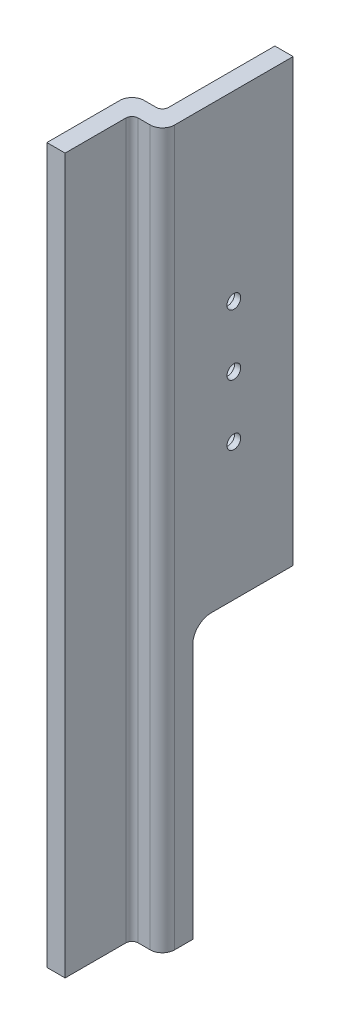
ISO-10303-21;
HEADER;
FILE_DESCRIPTION(('STEP AP214'),'2;1');
FILE_NAME('part.step','',(''),(''),'','','');
FILE_SCHEMA(('AUTOMOTIVE_DESIGN { 1 0 10303 214 1 1 1 1 }'));
ENDSEC;
DATA;
#1=APPLICATION_CONTEXT('core data for automotive mechanical design processes');
#2=APPLICATION_PROTOCOL_DEFINITION('international standard','automotive_design',2000,#1);
#3=PRODUCT_CONTEXT('',#1,'mechanical');
#4=PRODUCT('Part','Part','',(#3));
#5=PRODUCT_RELATED_PRODUCT_CATEGORY('part','',(#4));
#6=PRODUCT_DEFINITION_FORMATION('','',#4);
#7=PRODUCT_DEFINITION_CONTEXT('part definition',#1,'design');
#8=PRODUCT_DEFINITION('design','',#6,#7);
#9=PRODUCT_DEFINITION_SHAPE('','',#8);
#10=(LENGTH_UNIT() NAMED_UNIT(*) SI_UNIT(.MILLI.,.METRE.));
#11=(NAMED_UNIT(*) PLANE_ANGLE_UNIT() SI_UNIT($,.RADIAN.));
#12=(NAMED_UNIT(*) SI_UNIT($,.STERADIAN.) SOLID_ANGLE_UNIT());
#13=UNCERTAINTY_MEASURE_WITH_UNIT(LENGTH_MEASURE(1.E-05),#10,'distance_accuracy_value','');
#14=(GEOMETRIC_REPRESENTATION_CONTEXT(3) GLOBAL_UNCERTAINTY_ASSIGNED_CONTEXT((#13)) GLOBAL_UNIT_ASSIGNED_CONTEXT((#10,
#11,#12)) REPRESENTATION_CONTEXT('',''));
#15=CARTESIAN_POINT('',(0.,0.,0.));
#16=DIRECTION('',(0.,0.,1.));
#17=DIRECTION('',(1.,0.,0.));
#18=AXIS2_PLACEMENT_3D('',#15,#16,#17);
#19=CARTESIAN_POINT('',(0.,235.,-37.));
#20=DIRECTION('',(1.,0.,0.));
#21=DIRECTION('',(0.,0.,-1.));
#22=AXIS2_PLACEMENT_3D('',#19,#20,#21);
#23=PLANE('',#22);
#24=CARTESIAN_POINT('',(0.,175.,-17.5));
#25=DIRECTION('',(-1.,0.,0.));
#26=DIRECTION('',(0.,0.,1.));
#27=AXIS2_PLACEMENT_3D('',#24,#25,#26);
#28=CIRCLE('',#27,4.);
#29=CARTESIAN_POINT('',(0.,175.,-13.5));
#30=VERTEX_POINT('',#29);
#31=EDGE_CURVE('E317',#30,#30,#28,.T.);
#32=ORIENTED_EDGE('',*,*,#31,.F.);
#33=EDGE_LOOP('',(#32));
#34=FACE_BOUND('',#33,.T.);
#35=CARTESIAN_POINT('',(0.,135.,-17.5));
#36=DIRECTION('',(-1.,0.,0.));
#37=DIRECTION('',(0.,0.,1.));
#38=AXIS2_PLACEMENT_3D('',#35,#36,#37);
#39=CIRCLE('',#38,4.);
#40=CARTESIAN_POINT('',(0.,135.,-13.5));
#41=VERTEX_POINT('',#40);
#42=EDGE_CURVE('E293',#41,#41,#39,.T.);
#43=ORIENTED_EDGE('',*,*,#42,.F.);
#44=EDGE_LOOP('',(#43));
#45=FACE_BOUND('',#44,.T.);
#46=DIRECTION('',(0.,0.,1.));
#47=VECTOR('',#46,1.);
#48=CARTESIAN_POINT('',(0.,0.,-37.));
#49=LINE('',#48,#47);
#50=CARTESIAN_POINT('',(0.,0.,-4.));
#51=VERTEX_POINT('',#50);
#52=CARTESIAN_POINT('',(0.,0.,-2.));
#53=VERTEX_POINT('',#52);
#54=EDGE_CURVE('E240',#51,#53,#49,.T.);
#55=ORIENTED_EDGE('',*,*,#54,.T.);
#56=DIRECTION('',(0.,-1.,0.));
#57=VECTOR('',#56,1.);
#58=CARTESIAN_POINT('',(0.,235.,-2.));
#59=LINE('',#58,#57);
#60=CARTESIAN_POINT('',(0.,235.,-2.));
#61=VERTEX_POINT('',#60);
#62=EDGE_CURVE('E185',#53,#61,#59,.F.);
#63=ORIENTED_EDGE('',*,*,#62,.T.);
#64=DIRECTION('',(0.,0.,1.));
#65=VECTOR('',#64,1.);
#66=CARTESIAN_POINT('',(0.,235.,-37.));
#67=LINE('',#66,#65);
#68=CARTESIAN_POINT('',(0.,235.,-37.));
#69=VERTEX_POINT('',#68);
#70=EDGE_CURVE('E242',#69,#61,#67,.T.);
#71=ORIENTED_EDGE('',*,*,#70,.F.);
#72=DIRECTION('',(0.,-1.,0.));
#73=VECTOR('',#72,1.);
#74=CARTESIAN_POINT('',(0.,235.,-37.));
#75=LINE('',#74,#73);
#76=CARTESIAN_POINT('',(0.,90.,-37.));
#77=VERTEX_POINT('',#76);
#78=EDGE_CURVE('E248',#69,#77,#75,.T.);
#79=ORIENTED_EDGE('',*,*,#78,.T.);
#80=DIRECTION('',(0.,0.,1.));
#81=VECTOR('',#80,1.);
#82=CARTESIAN_POINT('',(0.,90.,-37.));
#83=LINE('',#82,#81);
#84=CARTESIAN_POINT('',(0.,90.,-10.));
#85=VERTEX_POINT('',#84);
#86=EDGE_CURVE('E169',#77,#85,#83,.T.);
#87=ORIENTED_EDGE('',*,*,#86,.T.);
#88=CARTESIAN_POINT('',(0.,84.,-10.));
#89=DIRECTION('',(1.,0.,0.));
#90=DIRECTION('',(0.,0.,-1.));
#91=AXIS2_PLACEMENT_3D('',#88,#89,#90);
#92=CIRCLE('',#91,6.);
#93=CARTESIAN_POINT('',(0.,84.,-4.));
#94=VERTEX_POINT('',#93);
#95=EDGE_CURVE('E11',#85,#94,#92,.T.);
#96=ORIENTED_EDGE('',*,*,#95,.T.);
#97=DIRECTION('',(0.,-1.,0.));
#98=VECTOR('',#97,1.);
#99=CARTESIAN_POINT('',(0.,235.,-4.));
#100=LINE('',#99,#98);
#101=EDGE_CURVE('E172',#94,#51,#100,.T.);
#102=ORIENTED_EDGE('',*,*,#101,.T.);
#103=EDGE_LOOP('',(#55,#63,#71,#79,#87,#96,#102));
#104=FACE_BOUND('',#103,.T.);
#105=CARTESIAN_POINT('',(0.,155.,-17.5));
#106=DIRECTION('',(-1.,0.,0.));
#107=DIRECTION('',(0.,0.,1.));
#108=AXIS2_PLACEMENT_3D('',#105,#106,#107);
#109=CIRCLE('',#108,4.);
#110=CARTESIAN_POINT('',(0.,155.,-13.5));
#111=VERTEX_POINT('',#110);
#112=EDGE_CURVE('E305',#111,#111,#109,.T.);
#113=ORIENTED_EDGE('',*,*,#112,.F.);
#114=EDGE_LOOP('',(#113));
#115=FACE_BOUND('',#114,.T.);
#116=ADVANCED_FACE('F36',(#34,#45,#104,#115),#23,.F.);
#117=CARTESIAN_POINT('',(-10.,235.,28.));
#118=DIRECTION('',(0.,0.,1.));
#119=DIRECTION('',(1.,0.,0.));
#120=AXIS2_PLACEMENT_3D('',#117,#118,#119);
#121=PLANE('',#120);
#122=DIRECTION('',(0.,-1.,0.));
#123=VECTOR('',#122,1.);
#124=CARTESIAN_POINT('',(-4.,235.,28.));
#125=LINE('',#124,#123);
#126=CARTESIAN_POINT('',(-4.,235.,28.));
#127=VERTEX_POINT('',#126);
#128=CARTESIAN_POINT('',(-4.,0.,28.));
#129=VERTEX_POINT('',#128);
#130=EDGE_CURVE('E145',#127,#129,#125,.T.);
#131=ORIENTED_EDGE('',*,*,#130,.F.);
#132=DIRECTION('',(1.,0.,0.));
#133=VECTOR('',#132,1.);
#134=CARTESIAN_POINT('',(-10.,235.,28.));
#135=LINE('',#134,#133);
#136=CARTESIAN_POINT('',(-10.,235.,28.));
#137=VERTEX_POINT('',#136);
#138=EDGE_CURVE('E160',#137,#127,#135,.T.);
#139=ORIENTED_EDGE('',*,*,#138,.F.);
#140=DIRECTION('',(0.,-1.,0.));
#141=VECTOR('',#140,1.);
#142=CARTESIAN_POINT('',(-10.,235.,28.));
#143=LINE('',#142,#141);
#144=CARTESIAN_POINT('',(-10.,0.,28.));
#145=VERTEX_POINT('',#144);
#146=EDGE_CURVE('E255',#137,#145,#143,.T.);
#147=ORIENTED_EDGE('',*,*,#146,.T.);
#148=DIRECTION('',(1.,0.,0.));
#149=VECTOR('',#148,1.);
#150=CARTESIAN_POINT('',(-10.,0.,28.));
#151=LINE('',#150,#149);
#152=EDGE_CURVE('E162',#145,#129,#151,.T.);
#153=ORIENTED_EDGE('',*,*,#152,.T.);
#154=EDGE_LOOP('',(#131,#139,#147,#153));
#155=FACE_BOUND('',#154,.T.);
#156=ADVANCED_FACE('F158',(#155),#121,.T.);
#157=CARTESIAN_POINT('',(-10.,235.,-37.));
#158=DIRECTION('',(0.,1.,0.));
#159=DIRECTION('',(0.,0.,1.));
#160=AXIS2_PLACEMENT_3D('',#157,#158,#159);
#161=PLANE('',#160);
#162=DIRECTION('',(-1.,0.,0.));
#163=VECTOR('',#162,1.);
#164=CARTESIAN_POINT('',(0.,235.,0.));
#165=LINE('',#164,#163);
#166=CARTESIAN_POINT('',(-2.,235.,0.));
#167=VERTEX_POINT('',#166);
#168=CARTESIAN_POINT('',(-6.,235.,0.));
#169=VERTEX_POINT('',#168);
#170=EDGE_CURVE('E245',#167,#169,#165,.T.);
#171=ORIENTED_EDGE('',*,*,#170,.T.);
#172=CARTESIAN_POINT('',(-6.,235.,4.));
#173=DIRECTION('',(0.,1.,0.));
#174=DIRECTION('',(0.,0.,1.));
#175=AXIS2_PLACEMENT_3D('',#172,#173,#174);
#176=CIRCLE('',#175,4.);
#177=CARTESIAN_POINT('',(-10.,235.,4.));
#178=VERTEX_POINT('',#177);
#179=EDGE_CURVE('E210',#169,#178,#176,.T.);
#180=ORIENTED_EDGE('',*,*,#179,.T.);
#181=DIRECTION('',(0.,0.,1.));
#182=VECTOR('',#181,1.);
#183=CARTESIAN_POINT('',(-10.,235.,-37.));
#184=LINE('',#183,#182);
#185=EDGE_CURVE('E168',#178,#137,#184,.T.);
#186=ORIENTED_EDGE('',*,*,#185,.T.);
#187=ORIENTED_EDGE('',*,*,#138,.T.);
#188=DIRECTION('',(0.,0.,-1.));
#189=VECTOR('',#188,1.);
#190=CARTESIAN_POINT('',(-4.,235.,28.));
#191=LINE('',#190,#189);
#192=CARTESIAN_POINT('',(-4.,235.,8.));
#193=VERTEX_POINT('',#192);
#194=EDGE_CURVE('E141',#127,#193,#191,.T.);
#195=ORIENTED_EDGE('',*,*,#194,.T.);
#196=CARTESIAN_POINT('',(-2.,235.,8.));
#197=DIRECTION('',(0.,1.,0.));
#198=DIRECTION('',(0.,0.,1.));
#199=AXIS2_PLACEMENT_3D('',#196,#197,#198);
#200=CIRCLE('',#199,2.);
#201=CARTESIAN_POINT('',(-2.,235.,6.));
#202=VERTEX_POINT('',#201);
#203=EDGE_CURVE('E197',#193,#202,#200,.F.);
#204=ORIENTED_EDGE('',*,*,#203,.T.);
#205=DIRECTION('',(1.,0.,0.));
#206=VECTOR('',#205,1.);
#207=CARTESIAN_POINT('',(-4.,235.,6.));
#208=LINE('',#207,#206);
#209=CARTESIAN_POINT('',(2.,235.,6.));
#210=VERTEX_POINT('',#209);
#211=EDGE_CURVE('E152',#202,#210,#208,.T.);
#212=ORIENTED_EDGE('',*,*,#211,.T.);
#213=CARTESIAN_POINT('',(2.,235.,2.));
#214=DIRECTION('',(0.,1.,0.));
#215=DIRECTION('',(0.,0.,1.));
#216=AXIS2_PLACEMENT_3D('',#213,#214,#215);
#217=CIRCLE('',#216,4.);
#218=CARTESIAN_POINT('',(6.,235.,2.));
#219=VERTEX_POINT('',#218);
#220=EDGE_CURVE('E208',#210,#219,#217,.T.);
#221=ORIENTED_EDGE('',*,*,#220,.T.);
#222=DIRECTION('',(0.,0.,1.));
#223=VECTOR('',#222,1.);
#224=CARTESIAN_POINT('',(6.,235.,-37.));
#225=LINE('',#224,#223);
#226=CARTESIAN_POINT('',(6.,235.,-37.));
#227=VERTEX_POINT('',#226);
#228=EDGE_CURVE('E177',#227,#219,#225,.T.);
#229=ORIENTED_EDGE('',*,*,#228,.F.);
#230=DIRECTION('',(1.,0.,0.));
#231=VECTOR('',#230,1.);
#232=CARTESIAN_POINT('',(-10.,235.,-37.));
#233=LINE('',#232,#231);
#234=EDGE_CURVE('E170',#69,#227,#233,.T.);
#235=ORIENTED_EDGE('',*,*,#234,.F.);
#236=ORIENTED_EDGE('',*,*,#70,.T.);
#237=CARTESIAN_POINT('',(-2.,235.,-2.));
#238=DIRECTION('',(0.,1.,0.));
#239=DIRECTION('',(0.,0.,1.));
#240=AXIS2_PLACEMENT_3D('',#237,#238,#239);
#241=CIRCLE('',#240,2.);
#242=EDGE_CURVE('E193',#61,#167,#241,.F.);
#243=ORIENTED_EDGE('',*,*,#242,.T.);
#244=EDGE_LOOP('',(#171,#180,#186,#187,#195,#204,#212,#221,#229,#235,#236,#243));
#245=FACE_BOUND('',#244,.T.);
#246=ADVANCED_FACE('F166',(#245),#161,.T.);
#247=CARTESIAN_POINT('',(-10.,0.,-37.));
#248=DIRECTION('',(0.,0.,-1.));
#249=DIRECTION('',(-1.,0.,0.));
#250=AXIS2_PLACEMENT_3D('',#247,#248,#249);
#251=PLANE('',#250);
#252=DIRECTION('',(1.,0.,0.));
#253=VECTOR('',#252,1.);
#254=CARTESIAN_POINT('',(-10.,90.,-37.));
#255=LINE('',#254,#253);
#256=CARTESIAN_POINT('',(6.,90.,-37.));
#257=VERTEX_POINT('',#256);
#258=EDGE_CURVE('E234',#77,#257,#255,.T.);
#259=ORIENTED_EDGE('',*,*,#258,.F.);
#260=ORIENTED_EDGE('',*,*,#78,.F.);
#261=ORIENTED_EDGE('',*,*,#234,.T.);
#262=DIRECTION('',(0.,1.,0.));
#263=VECTOR('',#262,1.);
#264=CARTESIAN_POINT('',(6.,0.,-37.));
#265=LINE('',#264,#263);
#266=EDGE_CURVE('E261',#257,#227,#265,.T.);
#267=ORIENTED_EDGE('',*,*,#266,.F.);
#268=EDGE_LOOP('',(#259,#260,#261,#267));
#269=FACE_BOUND('',#268,.T.);
#270=ADVANCED_FACE('F389',(#269),#251,.T.);
#271=CARTESIAN_POINT('',(-10.,0.,28.));
#272=DIRECTION('',(0.,-1.,0.));
#273=DIRECTION('',(0.,0.,-1.));
#274=AXIS2_PLACEMENT_3D('',#271,#272,#273);
#275=PLANE('',#274);
#276=DIRECTION('',(0.,0.,-1.));
#277=VECTOR('',#276,1.);
#278=CARTESIAN_POINT('',(-10.,0.,28.));
#279=LINE('',#278,#277);
#280=CARTESIAN_POINT('',(-10.,0.,4.));
#281=VERTEX_POINT('',#280);
#282=EDGE_CURVE('E257',#145,#281,#279,.T.);
#283=ORIENTED_EDGE('',*,*,#282,.T.);
#284=CARTESIAN_POINT('',(-6.,0.,4.));
#285=DIRECTION('',(0.,-1.,0.));
#286=DIRECTION('',(0.,0.,-1.));
#287=AXIS2_PLACEMENT_3D('',#284,#285,#286);
#288=CIRCLE('',#287,4.);
#289=CARTESIAN_POINT('',(-6.,0.,0.));
#290=VERTEX_POINT('',#289);
#291=EDGE_CURVE('E204',#281,#290,#288,.T.);
#292=ORIENTED_EDGE('',*,*,#291,.T.);
#293=DIRECTION('',(-1.,0.,0.));
#294=VECTOR('',#293,1.);
#295=CARTESIAN_POINT('',(0.,0.,0.));
#296=LINE('',#295,#294);
#297=CARTESIAN_POINT('',(-2.,0.,0.));
#298=VERTEX_POINT('',#297);
#299=EDGE_CURVE('E246',#298,#290,#296,.T.);
#300=ORIENTED_EDGE('',*,*,#299,.F.);
#301=CARTESIAN_POINT('',(-2.,0.,-2.));
#302=DIRECTION('',(0.,-1.,0.));
#303=DIRECTION('',(0.,0.,-1.));
#304=AXIS2_PLACEMENT_3D('',#301,#302,#303);
#305=CIRCLE('',#304,2.);
#306=EDGE_CURVE('E191',#298,#53,#305,.F.);
#307=ORIENTED_EDGE('',*,*,#306,.T.);
#308=ORIENTED_EDGE('',*,*,#54,.F.);
#309=DIRECTION('',(1.,0.,0.));
#310=VECTOR('',#309,1.);
#311=CARTESIAN_POINT('',(-10.,0.,-4.));
#312=LINE('',#311,#310);
#313=CARTESIAN_POINT('',(6.,0.,-4.));
#314=VERTEX_POINT('',#313);
#315=EDGE_CURVE('E236',#51,#314,#312,.T.);
#316=ORIENTED_EDGE('',*,*,#315,.T.);
#317=DIRECTION('',(0.,0.,-1.));
#318=VECTOR('',#317,1.);
#319=CARTESIAN_POINT('',(6.,0.,28.));
#320=LINE('',#319,#318);
#321=CARTESIAN_POINT('',(6.,0.,2.));
#322=VERTEX_POINT('',#321);
#323=EDGE_CURVE('E232',#322,#314,#320,.T.);
#324=ORIENTED_EDGE('',*,*,#323,.F.);
#325=CARTESIAN_POINT('',(2.,0.,2.));
#326=DIRECTION('',(0.,-1.,0.));
#327=DIRECTION('',(0.,0.,-1.));
#328=AXIS2_PLACEMENT_3D('',#325,#326,#327);
#329=CIRCLE('',#328,4.);
#330=CARTESIAN_POINT('',(2.,0.,6.));
#331=VERTEX_POINT('',#330);
#332=EDGE_CURVE('E202',#322,#331,#329,.T.);
#333=ORIENTED_EDGE('',*,*,#332,.T.);
#334=DIRECTION('',(1.,0.,0.));
#335=VECTOR('',#334,1.);
#336=CARTESIAN_POINT('',(-4.,0.,6.));
#337=LINE('',#336,#335);
#338=CARTESIAN_POINT('',(-2.,0.,6.));
#339=VERTEX_POINT('',#338);
#340=EDGE_CURVE('E153',#339,#331,#337,.T.);
#341=ORIENTED_EDGE('',*,*,#340,.F.);
#342=CARTESIAN_POINT('',(-2.,0.,8.));
#343=DIRECTION('',(0.,-1.,0.));
#344=DIRECTION('',(0.,0.,-1.));
#345=AXIS2_PLACEMENT_3D('',#342,#343,#344);
#346=CIRCLE('',#345,2.);
#347=CARTESIAN_POINT('',(-4.,0.,8.));
#348=VERTEX_POINT('',#347);
#349=EDGE_CURVE('E195',#339,#348,#346,.F.);
#350=ORIENTED_EDGE('',*,*,#349,.T.);
#351=DIRECTION('',(0.,0.,-1.));
#352=VECTOR('',#351,1.);
#353=CARTESIAN_POINT('',(-4.,0.,28.));
#354=LINE('',#353,#352);
#355=EDGE_CURVE('E279',#129,#348,#354,.T.);
#356=ORIENTED_EDGE('',*,*,#355,.F.);
#357=ORIENTED_EDGE('',*,*,#152,.F.);
#358=EDGE_LOOP('',(#283,#292,#300,#307,#308,#316,#324,#333,#341,#350,#356,#357));
#359=FACE_BOUND('',#358,.T.);
#360=ADVANCED_FACE('F273',(#359),#275,.T.);
#361=CARTESIAN_POINT('',(-10.,0.,0.));
#362=DIRECTION('',(1.,0.,0.));
#363=DIRECTION('',(0.,0.,-1.));
#364=AXIS2_PLACEMENT_3D('',#361,#362,#363);
#365=PLANE('',#364);
#366=ORIENTED_EDGE('',*,*,#185,.F.);
#367=DIRECTION('',(0.,-1.,0.));
#368=VECTOR('',#367,1.);
#369=CARTESIAN_POINT('',(-10.,0.,4.));
#370=LINE('',#369,#368);
#371=EDGE_CURVE('E199',#178,#281,#370,.T.);
#372=ORIENTED_EDGE('',*,*,#371,.T.);
#373=ORIENTED_EDGE('',*,*,#282,.F.);
#374=ORIENTED_EDGE('',*,*,#146,.F.);
#375=EDGE_LOOP('',(#366,#372,#373,#374));
#376=FACE_BOUND('',#375,.T.);
#377=ADVANCED_FACE('F380',(#376),#365,.F.);
#378=CARTESIAN_POINT('',(6.,0.,0.));
#379=DIRECTION('',(1.,0.,0.));
#380=DIRECTION('',(0.,0.,-1.));
#381=AXIS2_PLACEMENT_3D('',#378,#379,#380);
#382=PLANE('',#381);
#383=CARTESIAN_POINT('',(6.00000000000001,175.,-17.5));
#384=DIRECTION('',(-1.,0.,0.));
#385=DIRECTION('',(0.,0.,1.));
#386=AXIS2_PLACEMENT_3D('',#383,#384,#385);
#387=CIRCLE('',#386,2.25);
#388=CARTESIAN_POINT('',(6.00000000000001,175.,-15.25));
#389=VERTEX_POINT('',#388);
#390=EDGE_CURVE('E308',#389,#389,#387,.T.);
#391=ORIENTED_EDGE('',*,*,#390,.T.);
#392=EDGE_LOOP('',(#391));
#393=FACE_BOUND('',#392,.T.);
#394=CARTESIAN_POINT('',(6.00000000000001,155.,-17.5));
#395=DIRECTION('',(-1.,0.,0.));
#396=DIRECTION('',(0.,0.,1.));
#397=AXIS2_PLACEMENT_3D('',#394,#395,#396);
#398=CIRCLE('',#397,2.25);
#399=CARTESIAN_POINT('',(6.00000000000001,155.,-15.25));
#400=VERTEX_POINT('',#399);
#401=EDGE_CURVE('E296',#400,#400,#398,.T.);
#402=ORIENTED_EDGE('',*,*,#401,.T.);
#403=EDGE_LOOP('',(#402));
#404=FACE_BOUND('',#403,.T.);
#405=CARTESIAN_POINT('',(6.00000000000001,135.,-17.5));
#406=DIRECTION('',(-1.,0.,0.));
#407=DIRECTION('',(0.,0.,1.));
#408=AXIS2_PLACEMENT_3D('',#405,#406,#407);
#409=CIRCLE('',#408,2.25);
#410=CARTESIAN_POINT('',(6.00000000000001,135.,-15.25));
#411=VERTEX_POINT('',#410);
#412=EDGE_CURVE('E281',#411,#411,#409,.T.);
#413=ORIENTED_EDGE('',*,*,#412,.T.);
#414=EDGE_LOOP('',(#413));
#415=FACE_BOUND('',#414,.T.);
#416=ORIENTED_EDGE('',*,*,#228,.T.);
#417=DIRECTION('',(0.,-1.,0.));
#418=VECTOR('',#417,1.);
#419=CARTESIAN_POINT('',(6.,0.,2.));
#420=LINE('',#419,#418);
#421=EDGE_CURVE('E212',#219,#322,#420,.T.);
#422=ORIENTED_EDGE('',*,*,#421,.T.);
#423=ORIENTED_EDGE('',*,*,#323,.T.);
#424=DIRECTION('',(0.,-1.,0.));
#425=VECTOR('',#424,1.);
#426=CARTESIAN_POINT('',(6.,90.,-4.));
#427=LINE('',#426,#425);
#428=CARTESIAN_POINT('',(6.,84.,-4.));
#429=VERTEX_POINT('',#428);
#430=EDGE_CURVE('E225',#429,#314,#427,.T.);
#431=ORIENTED_EDGE('',*,*,#430,.F.);
#432=CARTESIAN_POINT('',(6.,84.,-10.));
#433=DIRECTION('',(1.,0.,0.));
#434=DIRECTION('',(0.,0.,-1.));
#435=AXIS2_PLACEMENT_3D('',#432,#433,#434);
#436=CIRCLE('',#435,6.);
#437=CARTESIAN_POINT('',(6.,90.,-10.));
#438=VERTEX_POINT('',#437);
#439=EDGE_CURVE('E44',#429,#438,#436,.F.);
#440=ORIENTED_EDGE('',*,*,#439,.T.);
#441=DIRECTION('',(0.,0.,1.));
#442=VECTOR('',#441,1.);
#443=CARTESIAN_POINT('',(6.,90.,-37.));
#444=LINE('',#443,#442);
#445=EDGE_CURVE('E163',#257,#438,#444,.T.);
#446=ORIENTED_EDGE('',*,*,#445,.F.);
#447=ORIENTED_EDGE('',*,*,#266,.T.);
#448=EDGE_LOOP('',(#416,#422,#423,#431,#440,#446,#447));
#449=FACE_BOUND('',#448,.T.);
#450=ADVANCED_FACE('F230',(#393,#404,#415,#449),#382,.T.);
#451=CARTESIAN_POINT('',(0.,235.,0.));
#452=DIRECTION('',(0.,0.,1.));
#453=DIRECTION('',(1.,0.,0.));
#454=AXIS2_PLACEMENT_3D('',#451,#452,#453);
#455=PLANE('',#454);
#456=ORIENTED_EDGE('',*,*,#299,.T.);
#457=DIRECTION('',(0.,-1.,0.));
#458=VECTOR('',#457,1.);
#459=CARTESIAN_POINT('',(-6.,235.,0.));
#460=LINE('',#459,#458);
#461=EDGE_CURVE('E206',#290,#169,#460,.F.);
#462=ORIENTED_EDGE('',*,*,#461,.T.);
#463=ORIENTED_EDGE('',*,*,#170,.F.);
#464=DIRECTION('',(0.,-1.,0.));
#465=VECTOR('',#464,1.);
#466=CARTESIAN_POINT('',(-2.,0.,0.));
#467=LINE('',#466,#465);
#468=EDGE_CURVE('E182',#167,#298,#467,.T.);
#469=ORIENTED_EDGE('',*,*,#468,.T.);
#470=EDGE_LOOP('',(#456,#462,#463,#469));
#471=FACE_BOUND('',#470,.T.);
#472=ADVANCED_FACE('F374',(#471),#455,.F.);
#473=CARTESIAN_POINT('',(-10.,90.,-4.));
#474=DIRECTION('',(0.,0.,1.));
#475=DIRECTION('',(1.,0.,0.));
#476=AXIS2_PLACEMENT_3D('',#473,#474,#475);
#477=PLANE('',#476);
#478=ORIENTED_EDGE('',*,*,#101,.F.);
#479=DIRECTION('',(1.,0.,0.));
#480=VECTOR('',#479,1.);
#481=CARTESIAN_POINT('',(6.,84.,-4.));
#482=LINE('',#481,#480);
#483=EDGE_CURVE('E217',#94,#429,#482,.T.);
#484=ORIENTED_EDGE('',*,*,#483,.T.);
#485=ORIENTED_EDGE('',*,*,#430,.T.);
#486=ORIENTED_EDGE('',*,*,#315,.F.);
#487=EDGE_LOOP('',(#478,#484,#485,#486));
#488=FACE_BOUND('',#487,.T.);
#489=ADVANCED_FACE('F223',(#488),#477,.F.);
#490=CARTESIAN_POINT('',(-10.,90.,-37.));
#491=DIRECTION('',(0.,1.,0.));
#492=DIRECTION('',(0.,0.,1.));
#493=AXIS2_PLACEMENT_3D('',#490,#491,#492);
#494=PLANE('',#493);
#495=ORIENTED_EDGE('',*,*,#445,.T.);
#496=DIRECTION('',(1.,0.,0.));
#497=VECTOR('',#496,1.);
#498=CARTESIAN_POINT('',(0.,90.,-10.));
#499=LINE('',#498,#497);
#500=EDGE_CURVE('E51',#438,#85,#499,.F.);
#501=ORIENTED_EDGE('',*,*,#500,.T.);
#502=ORIENTED_EDGE('',*,*,#86,.F.);
#503=ORIENTED_EDGE('',*,*,#258,.T.);
#504=EDGE_LOOP('',(#495,#501,#502,#503));
#505=FACE_BOUND('',#504,.T.);
#506=ADVANCED_FACE('F369',(#505),#494,.F.);
#507=CARTESIAN_POINT('',(-4.,235.,6.));
#508=DIRECTION('',(0.,0.,-1.));
#509=DIRECTION('',(-1.,0.,0.));
#510=AXIS2_PLACEMENT_3D('',#507,#508,#509);
#511=PLANE('',#510);
#512=ORIENTED_EDGE('',*,*,#340,.T.);
#513=DIRECTION('',(0.,-1.,0.));
#514=VECTOR('',#513,1.);
#515=CARTESIAN_POINT('',(2.,235.,6.));
#516=LINE('',#515,#514);
#517=EDGE_CURVE('E215',#331,#210,#516,.F.);
#518=ORIENTED_EDGE('',*,*,#517,.T.);
#519=ORIENTED_EDGE('',*,*,#211,.F.);
#520=DIRECTION('',(0.,-1.,0.));
#521=VECTOR('',#520,1.);
#522=CARTESIAN_POINT('',(-2.,0.,6.));
#523=LINE('',#522,#521);
#524=EDGE_CURVE('E187',#202,#339,#523,.T.);
#525=ORIENTED_EDGE('',*,*,#524,.T.);
#526=EDGE_LOOP('',(#512,#518,#519,#525));
#527=FACE_BOUND('',#526,.T.);
#528=ADVANCED_FACE('F275',(#527),#511,.F.);
#529=CARTESIAN_POINT('',(-4.,235.,28.));
#530=DIRECTION('',(-1.,0.,0.));
#531=DIRECTION('',(0.,0.,1.));
#532=AXIS2_PLACEMENT_3D('',#529,#530,#531);
#533=PLANE('',#532);
#534=ORIENTED_EDGE('',*,*,#355,.T.);
#535=DIRECTION('',(0.,-1.,0.));
#536=VECTOR('',#535,1.);
#537=CARTESIAN_POINT('',(-4.,235.,8.));
#538=LINE('',#537,#536);
#539=EDGE_CURVE('E148',#348,#193,#538,.F.);
#540=ORIENTED_EDGE('',*,*,#539,.T.);
#541=ORIENTED_EDGE('',*,*,#194,.F.);
#542=ORIENTED_EDGE('',*,*,#130,.T.);
#543=EDGE_LOOP('',(#534,#540,#541,#542));
#544=FACE_BOUND('',#543,.T.);
#545=ADVANCED_FACE('F144',(#544),#533,.F.);
#546=CARTESIAN_POINT('',(0.,135.,-17.5));
#547=DIRECTION('',(-1.,0.,0.));
#548=DIRECTION('',(0.,0.,1.));
#549=AXIS2_PLACEMENT_3D('',#546,#547,#548);
#550=CYLINDRICAL_SURFACE('',#549,2.25);
#551=ORIENTED_EDGE('',*,*,#412,.F.);
#552=EDGE_LOOP('',(#551));
#553=FACE_BOUND('',#552,.T.);
#554=CARTESIAN_POINT('',(3.99999999999999,135.,-17.5));
#555=DIRECTION('',(-1.,0.,0.));
#556=DIRECTION('',(0.,0.,1.));
#557=AXIS2_PLACEMENT_3D('',#554,#555,#556);
#558=CIRCLE('',#557,2.25);
#559=CARTESIAN_POINT('',(3.99999999999999,135.,-15.25));
#560=VERTEX_POINT('',#559);
#561=EDGE_CURVE('E287',#560,#560,#558,.T.);
#562=ORIENTED_EDGE('',*,*,#561,.T.);
#563=EDGE_LOOP('',(#562));
#564=FACE_BOUND('',#563,.T.);
#565=ADVANCED_FACE('F362',(#553,#564),#550,.F.);
#566=CARTESIAN_POINT('',(3.99999999999999,137.25,-17.5));
#567=DIRECTION('',(1.,0.,0.));
#568=DIRECTION('',(0.,0.,-1.));
#569=AXIS2_PLACEMENT_3D('',#566,#567,#568);
#570=PLANE('',#569);
#571=ORIENTED_EDGE('',*,*,#561,.F.);
#572=EDGE_LOOP('',(#571));
#573=FACE_BOUND('',#572,.T.);
#574=CARTESIAN_POINT('',(3.99999999999999,135.,-17.5));
#575=DIRECTION('',(-1.,0.,0.));
#576=DIRECTION('',(0.,0.,1.));
#577=AXIS2_PLACEMENT_3D('',#574,#575,#576);
#578=CIRCLE('',#577,4.);
#579=CARTESIAN_POINT('',(3.99999999999999,135.,-13.5));
#580=VERTEX_POINT('',#579);
#581=EDGE_CURVE('E290',#580,#580,#578,.T.);
#582=ORIENTED_EDGE('',*,*,#581,.T.);
#583=EDGE_LOOP('',(#582));
#584=FACE_BOUND('',#583,.T.);
#585=ADVANCED_FACE('F358',(#573,#584),#570,.F.);
#586=CARTESIAN_POINT('',(0.,135.,-17.5));
#587=DIRECTION('',(-1.,0.,0.));
#588=DIRECTION('',(0.,0.,1.));
#589=AXIS2_PLACEMENT_3D('',#586,#587,#588);
#590=CYLINDRICAL_SURFACE('',#589,4.);
#591=ORIENTED_EDGE('',*,*,#581,.F.);
#592=EDGE_LOOP('',(#591));
#593=FACE_BOUND('',#592,.T.);
#594=ORIENTED_EDGE('',*,*,#42,.T.);
#595=EDGE_LOOP('',(#594));
#596=FACE_BOUND('',#595,.T.);
#597=ADVANCED_FACE('F354',(#593,#596),#590,.F.);
#598=CARTESIAN_POINT('',(0.,155.,-17.5));
#599=DIRECTION('',(-1.,0.,0.));
#600=DIRECTION('',(0.,0.,1.));
#601=AXIS2_PLACEMENT_3D('',#598,#599,#600);
#602=CYLINDRICAL_SURFACE('',#601,2.25);
#603=ORIENTED_EDGE('',*,*,#401,.F.);
#604=EDGE_LOOP('',(#603));
#605=FACE_BOUND('',#604,.T.);
#606=CARTESIAN_POINT('',(3.99999999999999,155.,-17.5));
#607=DIRECTION('',(-1.,0.,0.));
#608=DIRECTION('',(0.,0.,1.));
#609=AXIS2_PLACEMENT_3D('',#606,#607,#608);
#610=CIRCLE('',#609,2.25);
#611=CARTESIAN_POINT('',(3.99999999999999,155.,-15.25));
#612=VERTEX_POINT('',#611);
#613=EDGE_CURVE('E299',#612,#612,#610,.T.);
#614=ORIENTED_EDGE('',*,*,#613,.T.);
#615=EDGE_LOOP('',(#614));
#616=FACE_BOUND('',#615,.T.);
#617=ADVANCED_FACE('F346',(#605,#616),#602,.F.);
#618=CARTESIAN_POINT('',(3.99999999999999,157.25,-17.5));
#619=DIRECTION('',(1.,0.,0.));
#620=DIRECTION('',(0.,0.,-1.));
#621=AXIS2_PLACEMENT_3D('',#618,#619,#620);
#622=PLANE('',#621);
#623=ORIENTED_EDGE('',*,*,#613,.F.);
#624=EDGE_LOOP('',(#623));
#625=FACE_BOUND('',#624,.T.);
#626=CARTESIAN_POINT('',(3.99999999999999,155.,-17.5));
#627=DIRECTION('',(-1.,0.,0.));
#628=DIRECTION('',(0.,0.,1.));
#629=AXIS2_PLACEMENT_3D('',#626,#627,#628);
#630=CIRCLE('',#629,4.);
#631=CARTESIAN_POINT('',(3.99999999999999,155.,-13.5));
#632=VERTEX_POINT('',#631);
#633=EDGE_CURVE('E302',#632,#632,#630,.T.);
#634=ORIENTED_EDGE('',*,*,#633,.T.);
#635=EDGE_LOOP('',(#634));
#636=FACE_BOUND('',#635,.T.);
#637=ADVANCED_FACE('F336',(#625,#636),#622,.F.);
#638=CARTESIAN_POINT('',(0.,155.,-17.5));
#639=DIRECTION('',(-1.,0.,0.));
#640=DIRECTION('',(0.,0.,1.));
#641=AXIS2_PLACEMENT_3D('',#638,#639,#640);
#642=CYLINDRICAL_SURFACE('',#641,4.);
#643=ORIENTED_EDGE('',*,*,#633,.F.);
#644=EDGE_LOOP('',(#643));
#645=FACE_BOUND('',#644,.T.);
#646=ORIENTED_EDGE('',*,*,#112,.T.);
#647=EDGE_LOOP('',(#646));
#648=FACE_BOUND('',#647,.T.);
#649=ADVANCED_FACE('F333',(#645,#648),#642,.F.);
#650=CARTESIAN_POINT('',(0.,175.,-17.5));
#651=DIRECTION('',(-1.,0.,0.));
#652=DIRECTION('',(0.,0.,1.));
#653=AXIS2_PLACEMENT_3D('',#650,#651,#652);
#654=CYLINDRICAL_SURFACE('',#653,2.25);
#655=ORIENTED_EDGE('',*,*,#390,.F.);
#656=EDGE_LOOP('',(#655));
#657=FACE_BOUND('',#656,.T.);
#658=CARTESIAN_POINT('',(3.99999999999999,175.,-17.5));
#659=DIRECTION('',(-1.,0.,0.));
#660=DIRECTION('',(0.,0.,1.));
#661=AXIS2_PLACEMENT_3D('',#658,#659,#660);
#662=CIRCLE('',#661,2.25);
#663=CARTESIAN_POINT('',(3.99999999999999,175.,-15.25));
#664=VERTEX_POINT('',#663);
#665=EDGE_CURVE('E311',#664,#664,#662,.T.);
#666=ORIENTED_EDGE('',*,*,#665,.T.);
#667=EDGE_LOOP('',(#666));
#668=FACE_BOUND('',#667,.T.);
#669=ADVANCED_FACE('F335',(#657,#668),#654,.F.);
#670=CARTESIAN_POINT('',(3.99999999999999,177.25,-17.5));
#671=DIRECTION('',(1.,0.,0.));
#672=DIRECTION('',(0.,0.,-1.));
#673=AXIS2_PLACEMENT_3D('',#670,#671,#672);
#674=PLANE('',#673);
#675=ORIENTED_EDGE('',*,*,#665,.F.);
#676=EDGE_LOOP('',(#675));
#677=FACE_BOUND('',#676,.T.);
#678=CARTESIAN_POINT('',(3.99999999999999,175.,-17.5));
#679=DIRECTION('',(-1.,0.,0.));
#680=DIRECTION('',(0.,0.,1.));
#681=AXIS2_PLACEMENT_3D('',#678,#679,#680);
#682=CIRCLE('',#681,4.);
#683=CARTESIAN_POINT('',(3.99999999999999,175.,-13.5));
#684=VERTEX_POINT('',#683);
#685=EDGE_CURVE('E314',#684,#684,#682,.T.);
#686=ORIENTED_EDGE('',*,*,#685,.T.);
#687=EDGE_LOOP('',(#686));
#688=FACE_BOUND('',#687,.T.);
#689=ADVANCED_FACE('F343',(#677,#688),#674,.F.);
#690=CARTESIAN_POINT('',(0.,175.,-17.5));
#691=DIRECTION('',(-1.,0.,0.));
#692=DIRECTION('',(0.,0.,1.));
#693=AXIS2_PLACEMENT_3D('',#690,#691,#692);
#694=CYLINDRICAL_SURFACE('',#693,4.);
#695=ORIENTED_EDGE('',*,*,#685,.F.);
#696=EDGE_LOOP('',(#695));
#697=FACE_BOUND('',#696,.T.);
#698=ORIENTED_EDGE('',*,*,#31,.T.);
#699=EDGE_LOOP('',(#698));
#700=FACE_BOUND('',#699,.T.);
#701=ADVANCED_FACE('F321',(#697,#700),#694,.F.);
#702=CARTESIAN_POINT('',(-2.,235.,-2.));
#703=DIRECTION('',(0.,1.,0.));
#704=DIRECTION('',(0.,0.,1.));
#705=AXIS2_PLACEMENT_3D('',#702,#703,#704);
#706=CYLINDRICAL_SURFACE('',#705,2.);
#707=ORIENTED_EDGE('',*,*,#242,.F.);
#708=ORIENTED_EDGE('',*,*,#62,.F.);
#709=ORIENTED_EDGE('',*,*,#306,.F.);
#710=ORIENTED_EDGE('',*,*,#468,.F.);
#711=EDGE_LOOP('',(#707,#708,#709,#710));
#712=FACE_BOUND('',#711,.T.);
#713=ADVANCED_FACE('F397',(#712),#706,.F.);
#714=CARTESIAN_POINT('',(-2.,235.,8.));
#715=DIRECTION('',(0.,1.,0.));
#716=DIRECTION('',(0.,0.,1.));
#717=AXIS2_PLACEMENT_3D('',#714,#715,#716);
#718=CYLINDRICAL_SURFACE('',#717,2.);
#719=ORIENTED_EDGE('',*,*,#203,.F.);
#720=ORIENTED_EDGE('',*,*,#539,.F.);
#721=ORIENTED_EDGE('',*,*,#349,.F.);
#722=ORIENTED_EDGE('',*,*,#524,.F.);
#723=EDGE_LOOP('',(#719,#720,#721,#722));
#724=FACE_BOUND('',#723,.T.);
#725=ADVANCED_FACE('F400',(#724),#718,.F.);
#726=CARTESIAN_POINT('',(-6.,0.,4.));
#727=DIRECTION('',(0.,-1.,0.));
#728=DIRECTION('',(0.,0.,-1.));
#729=AXIS2_PLACEMENT_3D('',#726,#727,#728);
#730=CYLINDRICAL_SURFACE('',#729,4.);
#731=ORIENTED_EDGE('',*,*,#179,.F.);
#732=ORIENTED_EDGE('',*,*,#461,.F.);
#733=ORIENTED_EDGE('',*,*,#291,.F.);
#734=ORIENTED_EDGE('',*,*,#371,.F.);
#735=EDGE_LOOP('',(#731,#732,#733,#734));
#736=FACE_BOUND('',#735,.T.);
#737=ADVANCED_FACE('F404',(#736),#730,.T.);
#738=CARTESIAN_POINT('',(2.,0.,2.));
#739=DIRECTION('',(0.,1.,0.));
#740=DIRECTION('',(0.,0.,1.));
#741=AXIS2_PLACEMENT_3D('',#738,#739,#740);
#742=CYLINDRICAL_SURFACE('',#741,4.);
#743=ORIENTED_EDGE('',*,*,#220,.F.);
#744=ORIENTED_EDGE('',*,*,#517,.F.);
#745=ORIENTED_EDGE('',*,*,#332,.F.);
#746=ORIENTED_EDGE('',*,*,#421,.F.);
#747=EDGE_LOOP('',(#743,#744,#745,#746));
#748=FACE_BOUND('',#747,.T.);
#749=ADVANCED_FACE('F268',(#748),#742,.T.);
#750=CARTESIAN_POINT('',(-10.,84.,-10.));
#751=DIRECTION('',(-1.,0.,0.));
#752=DIRECTION('',(0.,0.,1.));
#753=AXIS2_PLACEMENT_3D('',#750,#751,#752);
#754=CYLINDRICAL_SURFACE('',#753,6.);
#755=ORIENTED_EDGE('',*,*,#95,.F.);
#756=ORIENTED_EDGE('',*,*,#500,.F.);
#757=ORIENTED_EDGE('',*,*,#439,.F.);
#758=ORIENTED_EDGE('',*,*,#483,.F.);
#759=EDGE_LOOP('',(#755,#756,#757,#758));
#760=FACE_BOUND('',#759,.T.);
#761=ADVANCED_FACE('F38',(#760),#754,.F.);
#762=CLOSED_SHELL('',(#116,#156,#246,#270,#360,#377,#450,#472,#489,#506,#528,#545,#565,#585,
#597,#617,#637,#649,#669,#689,#701,#713,#725,#737,#749,#761));
#763=MANIFOLD_SOLID_BREP('B2',#762);
#764=ADVANCED_BREP_SHAPE_REPRESENTATION('',(#18,#763),#14);
#765=SHAPE_DEFINITION_REPRESENTATION(#9,#764);
ENDSEC;
END-ISO-10303-21;
